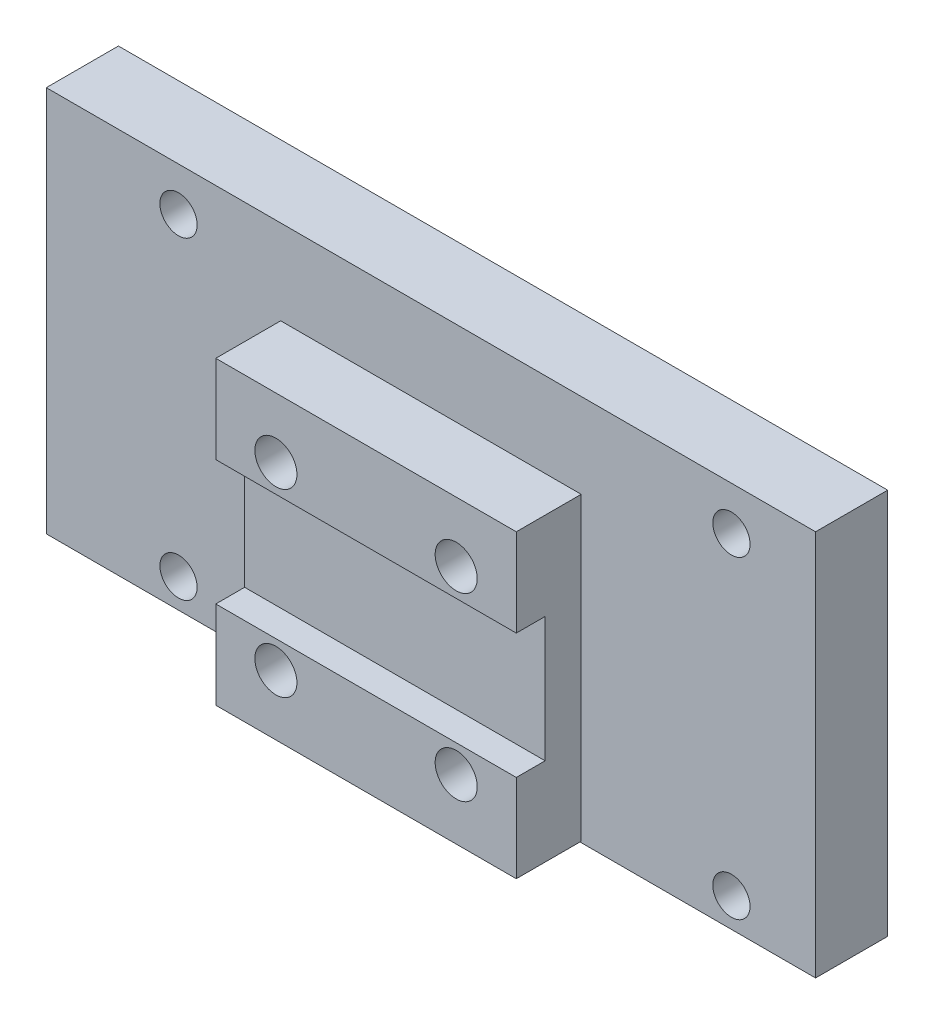
ISO-10303-21;
HEADER;
FILE_DESCRIPTION(('STEP AP214'),'2;1');
FILE_NAME('part.step','',(''),(''),'','','');
FILE_SCHEMA(('AUTOMOTIVE_DESIGN { 1 0 10303 214 1 1 1 1 }'));
ENDSEC;
DATA;
#1=APPLICATION_CONTEXT('core data for automotive mechanical design processes');
#2=APPLICATION_PROTOCOL_DEFINITION('international standard','automotive_design',2000,#1);
#3=PRODUCT_CONTEXT('',#1,'mechanical');
#4=PRODUCT('Part','Part','',(#3));
#5=PRODUCT_RELATED_PRODUCT_CATEGORY('part','',(#4));
#6=PRODUCT_DEFINITION_FORMATION('','',#4);
#7=PRODUCT_DEFINITION_CONTEXT('part definition',#1,'design');
#8=PRODUCT_DEFINITION('design','',#6,#7);
#9=PRODUCT_DEFINITION_SHAPE('','',#8);
#10=(LENGTH_UNIT() NAMED_UNIT(*) SI_UNIT(.MILLI.,.METRE.));
#11=(NAMED_UNIT(*) PLANE_ANGLE_UNIT() SI_UNIT($,.RADIAN.));
#12=(NAMED_UNIT(*) SI_UNIT($,.STERADIAN.) SOLID_ANGLE_UNIT());
#13=UNCERTAINTY_MEASURE_WITH_UNIT(LENGTH_MEASURE(1.E-05),#10,'distance_accuracy_value','');
#14=(GEOMETRIC_REPRESENTATION_CONTEXT(3) GLOBAL_UNCERTAINTY_ASSIGNED_CONTEXT((#13)) GLOBAL_UNIT_ASSIGNED_CONTEXT((#10,
#11,#12)) REPRESENTATION_CONTEXT('',''));
#15=CARTESIAN_POINT('',(0.,0.,0.));
#16=DIRECTION('',(0.,0.,1.));
#17=DIRECTION('',(1.,0.,0.));
#18=AXIS2_PLACEMENT_3D('',#15,#16,#17);
#19=CARTESIAN_POINT('',(0.,0.,3.));
#20=DIRECTION('',(0.,0.,-1.));
#21=DIRECTION('',(-1.,0.,0.));
#22=AXIS2_PLACEMENT_3D('',#19,#20,#21);
#23=PLANE('',#22);
#24=DIRECTION('',(-1.,0.,0.));
#25=VECTOR('',#24,1.);
#26=CARTESIAN_POINT('',(25.,7.30000000000001,3.));
#27=LINE('',#26,#25);
#28=CARTESIAN_POINT('',(25.,7.30000000000001,3.));
#29=VERTEX_POINT('',#28);
#30=CARTESIAN_POINT('',(0.,7.30000000000001,3.));
#31=VERTEX_POINT('',#30);
#32=EDGE_CURVE('E203',#29,#31,#27,.T.);
#33=ORIENTED_EDGE('',*,*,#32,.F.);
#34=DIRECTION('',(0.,1.,0.));
#35=VECTOR('',#34,1.);
#36=CARTESIAN_POINT('',(25.,0.,3.));
#37=LINE('',#36,#35);
#38=CARTESIAN_POINT('',(25.,17.7,3.));
#39=VERTEX_POINT('',#38);
#40=EDGE_CURVE('E246',#29,#39,#37,.T.);
#41=ORIENTED_EDGE('',*,*,#40,.T.);
#42=DIRECTION('',(1.,0.,0.));
#43=VECTOR('',#42,1.);
#44=CARTESIAN_POINT('',(0.,17.7,3.));
#45=LINE('',#44,#43);
#46=CARTESIAN_POINT('',(0.,17.7,3.));
#47=VERTEX_POINT('',#46);
#48=EDGE_CURVE('E223',#47,#39,#45,.T.);
#49=ORIENTED_EDGE('',*,*,#48,.F.);
#50=DIRECTION('',(0.,-1.,0.));
#51=VECTOR('',#50,1.);
#52=CARTESIAN_POINT('',(0.,0.,3.));
#53=LINE('',#52,#51);
#54=EDGE_CURVE('E244',#47,#31,#53,.T.);
#55=ORIENTED_EDGE('',*,*,#54,.T.);
#56=EDGE_LOOP('',(#33,#41,#49,#55));
#57=FACE_BOUND('',#56,.T.);
#58=ADVANCED_FACE('F37',(#57),#23,.F.);
#59=CARTESIAN_POINT('',(0.,0.,3.));
#60=DIRECTION('',(1.,0.,0.));
#61=DIRECTION('',(0.,0.,-1.));
#62=AXIS2_PLACEMENT_3D('',#59,#60,#61);
#63=PLANE('',#62);
#64=DIRECTION('',(0.,-1.,0.));
#65=VECTOR('',#64,1.);
#66=CARTESIAN_POINT('',(0.,0.,0.));
#67=LINE('',#66,#65);
#68=CARTESIAN_POINT('',(0.,25.,0.));
#69=VERTEX_POINT('',#68);
#70=CARTESIAN_POINT('',(0.,0.,0.));
#71=VERTEX_POINT('',#70);
#72=EDGE_CURVE('E243',#69,#71,#67,.T.);
#73=ORIENTED_EDGE('',*,*,#72,.T.);
#74=DIRECTION('',(0.,0.,-1.));
#75=VECTOR('',#74,1.);
#76=CARTESIAN_POINT('',(0.,0.,3.));
#77=LINE('',#76,#75);
#78=CARTESIAN_POINT('',(0.,0.,5.4));
#79=VERTEX_POINT('',#78);
#80=EDGE_CURVE('E11',#79,#71,#77,.T.);
#81=ORIENTED_EDGE('',*,*,#80,.F.);
#82=DIRECTION('',(0.,-1.,0.));
#83=VECTOR('',#82,1.);
#84=CARTESIAN_POINT('',(0.,7.3,5.4));
#85=LINE('',#84,#83);
#86=CARTESIAN_POINT('',(0.,7.3,5.4));
#87=VERTEX_POINT('',#86);
#88=EDGE_CURVE('E209',#87,#79,#85,.T.);
#89=ORIENTED_EDGE('',*,*,#88,.F.);
#90=DIRECTION('',(0.,0.,-1.));
#91=VECTOR('',#90,1.);
#92=CARTESIAN_POINT('',(0.,7.3,5.4));
#93=LINE('',#92,#91);
#94=EDGE_CURVE('E215',#87,#31,#93,.T.);
#95=ORIENTED_EDGE('',*,*,#94,.T.);
#96=ORIENTED_EDGE('',*,*,#54,.F.);
#97=DIRECTION('',(0.,0.,-1.));
#98=VECTOR('',#97,1.);
#99=CARTESIAN_POINT('',(0.,17.7,5.4));
#100=LINE('',#99,#98);
#101=CARTESIAN_POINT('',(0.,17.7,5.4));
#102=VERTEX_POINT('',#101);
#103=EDGE_CURVE('E240',#102,#47,#100,.T.);
#104=ORIENTED_EDGE('',*,*,#103,.F.);
#105=DIRECTION('',(0.,-1.,0.));
#106=VECTOR('',#105,1.);
#107=CARTESIAN_POINT('',(0.,25.,5.4));
#108=LINE('',#107,#106);
#109=CARTESIAN_POINT('',(0.,25.,5.4));
#110=VERTEX_POINT('',#109);
#111=EDGE_CURVE('E224',#110,#102,#108,.T.);
#112=ORIENTED_EDGE('',*,*,#111,.F.);
#113=DIRECTION('',(0.,0.,-1.));
#114=VECTOR('',#113,1.);
#115=CARTESIAN_POINT('',(0.,25.,3.));
#116=LINE('',#115,#114);
#117=EDGE_CURVE('E249',#110,#69,#116,.T.);
#118=ORIENTED_EDGE('',*,*,#117,.T.);
#119=EDGE_LOOP('',(#73,#81,#89,#95,#96,#104,#112,#118));
#120=FACE_BOUND('',#119,.T.);
#121=ADVANCED_FACE('F39',(#120),#63,.F.);
#122=CARTESIAN_POINT('',(0.,0.,3.));
#123=DIRECTION('',(0.,1.,0.));
#124=DIRECTION('',(0.,0.,1.));
#125=AXIS2_PLACEMENT_3D('',#122,#123,#124);
#126=PLANE('',#125);
#127=DIRECTION('',(1.,0.,0.));
#128=VECTOR('',#127,1.);
#129=CARTESIAN_POINT('',(0.,0.,0.));
#130=LINE('',#129,#128);
#131=CARTESIAN_POINT('',(25.,0.,0.));
#132=VERTEX_POINT('',#131);
#133=EDGE_CURVE('E252',#71,#132,#130,.T.);
#134=ORIENTED_EDGE('',*,*,#133,.T.);
#135=DIRECTION('',(0.,0.,-1.));
#136=VECTOR('',#135,1.);
#137=CARTESIAN_POINT('',(25.,0.,3.));
#138=LINE('',#137,#136);
#139=CARTESIAN_POINT('',(25.,0.,5.4));
#140=VERTEX_POINT('',#139);
#141=EDGE_CURVE('E46',#140,#132,#138,.T.);
#142=ORIENTED_EDGE('',*,*,#141,.F.);
#143=DIRECTION('',(1.,0.,0.));
#144=VECTOR('',#143,1.);
#145=CARTESIAN_POINT('',(0.,0.,5.4));
#146=LINE('',#145,#144);
#147=EDGE_CURVE('E212',#79,#140,#146,.T.);
#148=ORIENTED_EDGE('',*,*,#147,.F.);
#149=ORIENTED_EDGE('',*,*,#80,.T.);
#150=EDGE_LOOP('',(#134,#142,#148,#149));
#151=FACE_BOUND('',#150,.T.);
#152=ADVANCED_FACE('F364',(#151),#126,.F.);
#153=CARTESIAN_POINT('',(25.,0.,3.));
#154=DIRECTION('',(-1.,0.,0.));
#155=DIRECTION('',(0.,0.,1.));
#156=AXIS2_PLACEMENT_3D('',#153,#154,#155);
#157=PLANE('',#156);
#158=DIRECTION('',(0.,1.,0.));
#159=VECTOR('',#158,1.);
#160=CARTESIAN_POINT('',(25.,0.,0.));
#161=LINE('',#160,#159);
#162=CARTESIAN_POINT('',(25.,25.,0.));
#163=VERTEX_POINT('',#162);
#164=EDGE_CURVE('E255',#132,#163,#161,.T.);
#165=ORIENTED_EDGE('',*,*,#164,.T.);
#166=DIRECTION('',(0.,0.,-1.));
#167=VECTOR('',#166,1.);
#168=CARTESIAN_POINT('',(25.,25.,3.));
#169=LINE('',#168,#167);
#170=CARTESIAN_POINT('',(25.,25.,5.4));
#171=VERTEX_POINT('',#170);
#172=EDGE_CURVE('E262',#171,#163,#169,.T.);
#173=ORIENTED_EDGE('',*,*,#172,.F.);
#174=DIRECTION('',(0.,1.,0.));
#175=VECTOR('',#174,1.);
#176=CARTESIAN_POINT('',(25.,17.7,5.4));
#177=LINE('',#176,#175);
#178=CARTESIAN_POINT('',(25.,17.7,5.4));
#179=VERTEX_POINT('',#178);
#180=EDGE_CURVE('E229',#179,#171,#177,.T.);
#181=ORIENTED_EDGE('',*,*,#180,.F.);
#182=DIRECTION('',(0.,0.,-1.));
#183=VECTOR('',#182,1.);
#184=CARTESIAN_POINT('',(25.,17.7,5.4));
#185=LINE('',#184,#183);
#186=EDGE_CURVE('E235',#179,#39,#185,.T.);
#187=ORIENTED_EDGE('',*,*,#186,.T.);
#188=ORIENTED_EDGE('',*,*,#40,.F.);
#189=DIRECTION('',(0.,0.,-1.));
#190=VECTOR('',#189,1.);
#191=CARTESIAN_POINT('',(25.,7.30000000000001,5.4));
#192=LINE('',#191,#190);
#193=CARTESIAN_POINT('',(25.,7.30000000000001,5.4));
#194=VERTEX_POINT('',#193);
#195=EDGE_CURVE('E220',#194,#29,#192,.T.);
#196=ORIENTED_EDGE('',*,*,#195,.F.);
#197=DIRECTION('',(0.,1.,0.));
#198=VECTOR('',#197,1.);
#199=CARTESIAN_POINT('',(25.,0.,5.4));
#200=LINE('',#199,#198);
#201=EDGE_CURVE('E204',#140,#194,#200,.T.);
#202=ORIENTED_EDGE('',*,*,#201,.F.);
#203=ORIENTED_EDGE('',*,*,#141,.T.);
#204=EDGE_LOOP('',(#165,#173,#181,#187,#188,#196,#202,#203));
#205=FACE_BOUND('',#204,.T.);
#206=ADVANCED_FACE('F374',(#205),#157,.F.);
#207=CARTESIAN_POINT('',(0.,25.,3.));
#208=DIRECTION('',(0.,-1.,0.));
#209=DIRECTION('',(0.,0.,-1.));
#210=AXIS2_PLACEMENT_3D('',#207,#208,#209);
#211=PLANE('',#210);
#212=DIRECTION('',(-1.,0.,0.));
#213=VECTOR('',#212,1.);
#214=CARTESIAN_POINT('',(0.,25.,0.));
#215=LINE('',#214,#213);
#216=EDGE_CURVE('E247',#163,#69,#215,.T.);
#217=ORIENTED_EDGE('',*,*,#216,.T.);
#218=ORIENTED_EDGE('',*,*,#117,.F.);
#219=DIRECTION('',(-1.,0.,0.));
#220=VECTOR('',#219,1.);
#221=CARTESIAN_POINT('',(25.,25.,5.4));
#222=LINE('',#221,#220);
#223=EDGE_CURVE('E232',#171,#110,#222,.T.);
#224=ORIENTED_EDGE('',*,*,#223,.F.);
#225=ORIENTED_EDGE('',*,*,#172,.T.);
#226=EDGE_LOOP('',(#217,#218,#224,#225));
#227=FACE_BOUND('',#226,.T.);
#228=ADVANCED_FACE('F371',(#227),#211,.F.);
#229=CARTESIAN_POINT('',(5.,20.,3.));
#230=DIRECTION('',(0.,0.,-1.));
#231=DIRECTION('',(-1.,0.,0.));
#232=AXIS2_PLACEMENT_3D('',#229,#230,#231);
#233=CYLINDRICAL_SURFACE('',#232,1.75);
#234=CARTESIAN_POINT('',(5.,20.,5.4));
#235=DIRECTION('',(0.,0.,1.));
#236=DIRECTION('',(1.,0.,0.));
#237=AXIS2_PLACEMENT_3D('',#234,#235,#236);
#238=CIRCLE('',#237,1.75);
#239=CARTESIAN_POINT('',(6.75000000000001,20.,5.4));
#240=VERTEX_POINT('',#239);
#241=EDGE_CURVE('E191',#240,#240,#238,.T.);
#242=ORIENTED_EDGE('',*,*,#241,.T.);
#243=EDGE_LOOP('',(#242));
#244=FACE_BOUND('',#243,.T.);
#245=CARTESIAN_POINT('',(5.,20.,-1.));
#246=DIRECTION('',(0.,0.,-1.));
#247=DIRECTION('',(-1.,0.,0.));
#248=AXIS2_PLACEMENT_3D('',#245,#246,#247);
#249=CIRCLE('',#248,1.75);
#250=CARTESIAN_POINT('',(3.25,20.,-1.));
#251=VERTEX_POINT('',#250);
#252=EDGE_CURVE('E41',#251,#251,#249,.T.);
#253=ORIENTED_EDGE('',*,*,#252,.T.);
#254=EDGE_LOOP('',(#253));
#255=FACE_BOUND('',#254,.T.);
#256=ADVANCED_FACE('F369',(#244,#255),#233,.F.);
#257=CARTESIAN_POINT('',(20.,20.,3.));
#258=DIRECTION('',(0.,0.,-1.));
#259=DIRECTION('',(-1.,0.,0.));
#260=AXIS2_PLACEMENT_3D('',#257,#258,#259);
#261=CYLINDRICAL_SURFACE('',#260,1.75);
#262=CARTESIAN_POINT('',(20.,20.,5.4));
#263=DIRECTION('',(0.,0.,1.));
#264=DIRECTION('',(1.,0.,0.));
#265=AXIS2_PLACEMENT_3D('',#262,#263,#264);
#266=CIRCLE('',#265,1.75);
#267=CARTESIAN_POINT('',(21.75,20.,5.4));
#268=VERTEX_POINT('',#267);
#269=EDGE_CURVE('E196',#268,#268,#266,.T.);
#270=ORIENTED_EDGE('',*,*,#269,.T.);
#271=EDGE_LOOP('',(#270));
#272=FACE_BOUND('',#271,.T.);
#273=CARTESIAN_POINT('',(20.,20.,-1.));
#274=DIRECTION('',(0.,0.,-1.));
#275=DIRECTION('',(-1.,0.,0.));
#276=AXIS2_PLACEMENT_3D('',#273,#274,#275);
#277=CIRCLE('',#276,1.75);
#278=CARTESIAN_POINT('',(18.25,20.,-1.));
#279=VERTEX_POINT('',#278);
#280=EDGE_CURVE('E284',#279,#279,#277,.T.);
#281=ORIENTED_EDGE('',*,*,#280,.T.);
#282=EDGE_LOOP('',(#281));
#283=FACE_BOUND('',#282,.T.);
#284=ADVANCED_FACE('F424',(#272,#283),#261,.F.);
#285=CARTESIAN_POINT('',(5.,5.,3.));
#286=DIRECTION('',(0.,0.,-1.));
#287=DIRECTION('',(-1.,0.,0.));
#288=AXIS2_PLACEMENT_3D('',#285,#286,#287);
#289=CYLINDRICAL_SURFACE('',#288,1.75);
#290=CARTESIAN_POINT('',(5.,5.,5.4));
#291=DIRECTION('',(0.,0.,1.));
#292=DIRECTION('',(1.,0.,0.));
#293=AXIS2_PLACEMENT_3D('',#290,#291,#292);
#294=CIRCLE('',#293,1.75);
#295=CARTESIAN_POINT('',(6.75,5.,5.4));
#296=VERTEX_POINT('',#295);
#297=EDGE_CURVE('E195',#296,#296,#294,.T.);
#298=ORIENTED_EDGE('',*,*,#297,.T.);
#299=EDGE_LOOP('',(#298));
#300=FACE_BOUND('',#299,.T.);
#301=CARTESIAN_POINT('',(5.,5.,-1.));
#302=DIRECTION('',(0.,0.,-1.));
#303=DIRECTION('',(-1.,0.,0.));
#304=AXIS2_PLACEMENT_3D('',#301,#302,#303);
#305=CIRCLE('',#304,1.75);
#306=CARTESIAN_POINT('',(3.25,5.,-1.));
#307=VERTEX_POINT('',#306);
#308=EDGE_CURVE('E157',#307,#307,#305,.T.);
#309=ORIENTED_EDGE('',*,*,#308,.T.);
#310=EDGE_LOOP('',(#309));
#311=FACE_BOUND('',#310,.T.);
#312=ADVANCED_FACE('F421',(#300,#311),#289,.F.);
#313=CARTESIAN_POINT('',(20.,5.,3.));
#314=DIRECTION('',(0.,0.,-1.));
#315=DIRECTION('',(-1.,0.,0.));
#316=AXIS2_PLACEMENT_3D('',#313,#314,#315);
#317=CYLINDRICAL_SURFACE('',#316,1.75);
#318=CARTESIAN_POINT('',(20.,5.,5.4));
#319=DIRECTION('',(0.,0.,1.));
#320=DIRECTION('',(1.,0.,0.));
#321=AXIS2_PLACEMENT_3D('',#318,#319,#320);
#322=CIRCLE('',#321,1.75);
#323=CARTESIAN_POINT('',(21.75,5.,5.4));
#324=VERTEX_POINT('',#323);
#325=EDGE_CURVE('E192',#324,#324,#322,.T.);
#326=ORIENTED_EDGE('',*,*,#325,.T.);
#327=EDGE_LOOP('',(#326));
#328=FACE_BOUND('',#327,.T.);
#329=CARTESIAN_POINT('',(20.,5.,-1.));
#330=DIRECTION('',(0.,0.,-1.));
#331=DIRECTION('',(-1.,0.,0.));
#332=AXIS2_PLACEMENT_3D('',#329,#330,#331);
#333=CIRCLE('',#332,1.75);
#334=CARTESIAN_POINT('',(18.25,5.,-1.));
#335=VERTEX_POINT('',#334);
#336=EDGE_CURVE('E282',#335,#335,#333,.T.);
#337=ORIENTED_EDGE('',*,*,#336,.T.);
#338=EDGE_LOOP('',(#337));
#339=FACE_BOUND('',#338,.T.);
#340=ADVANCED_FACE('F416',(#328,#339),#317,.F.);
#341=CARTESIAN_POINT('',(0.,0.,5.4));
#342=DIRECTION('',(0.,0.,1.));
#343=DIRECTION('',(1.,0.,0.));
#344=AXIS2_PLACEMENT_3D('',#341,#342,#343);
#345=PLANE('',#344);
#346=ORIENTED_EDGE('',*,*,#241,.F.);
#347=EDGE_LOOP('',(#346));
#348=FACE_BOUND('',#347,.T.);
#349=ORIENTED_EDGE('',*,*,#269,.F.);
#350=EDGE_LOOP('',(#349));
#351=FACE_BOUND('',#350,.T.);
#352=ORIENTED_EDGE('',*,*,#111,.T.);
#353=DIRECTION('',(1.,0.,0.));
#354=VECTOR('',#353,1.);
#355=CARTESIAN_POINT('',(0.,17.7,5.4));
#356=LINE('',#355,#354);
#357=EDGE_CURVE('E227',#102,#179,#356,.T.);
#358=ORIENTED_EDGE('',*,*,#357,.T.);
#359=ORIENTED_EDGE('',*,*,#180,.T.);
#360=ORIENTED_EDGE('',*,*,#223,.T.);
#361=EDGE_LOOP('',(#352,#358,#359,#360));
#362=FACE_BOUND('',#361,.T.);
#363=ADVANCED_FACE('F397',(#348,#351,#362),#345,.T.);
#364=CARTESIAN_POINT('',(0.,17.7,5.4));
#365=DIRECTION('',(0.,1.,0.));
#366=DIRECTION('',(0.,0.,1.));
#367=AXIS2_PLACEMENT_3D('',#364,#365,#366);
#368=PLANE('',#367);
#369=ORIENTED_EDGE('',*,*,#48,.T.);
#370=ORIENTED_EDGE('',*,*,#186,.F.);
#371=ORIENTED_EDGE('',*,*,#357,.F.);
#372=ORIENTED_EDGE('',*,*,#103,.T.);
#373=EDGE_LOOP('',(#369,#370,#371,#372));
#374=FACE_BOUND('',#373,.T.);
#375=ADVANCED_FACE('F401',(#374),#368,.F.);
#376=CARTESIAN_POINT('',(25.,7.30000000000001,5.4));
#377=DIRECTION('',(0.,-1.,0.));
#378=DIRECTION('',(1.,0.,0.));
#379=AXIS2_PLACEMENT_3D('',#376,#377,#378);
#380=PLANE('',#379);
#381=ORIENTED_EDGE('',*,*,#32,.T.);
#382=ORIENTED_EDGE('',*,*,#94,.F.);
#383=DIRECTION('',(-1.,0.,0.));
#384=VECTOR('',#383,1.);
#385=CARTESIAN_POINT('',(25.,7.30000000000001,5.4));
#386=LINE('',#385,#384);
#387=EDGE_CURVE('E207',#194,#87,#386,.T.);
#388=ORIENTED_EDGE('',*,*,#387,.F.);
#389=ORIENTED_EDGE('',*,*,#195,.T.);
#390=EDGE_LOOP('',(#381,#382,#388,#389));
#391=FACE_BOUND('',#390,.T.);
#392=ADVANCED_FACE('F403',(#391),#380,.F.);
#393=CARTESIAN_POINT('',(0.,0.,5.4));
#394=DIRECTION('',(0.,0.,1.));
#395=DIRECTION('',(1.,0.,0.));
#396=AXIS2_PLACEMENT_3D('',#393,#394,#395);
#397=PLANE('',#396);
#398=ORIENTED_EDGE('',*,*,#325,.F.);
#399=EDGE_LOOP('',(#398));
#400=FACE_BOUND('',#399,.T.);
#401=ORIENTED_EDGE('',*,*,#297,.F.);
#402=EDGE_LOOP('',(#401));
#403=FACE_BOUND('',#402,.T.);
#404=ORIENTED_EDGE('',*,*,#201,.T.);
#405=ORIENTED_EDGE('',*,*,#387,.T.);
#406=ORIENTED_EDGE('',*,*,#88,.T.);
#407=ORIENTED_EDGE('',*,*,#147,.T.);
#408=EDGE_LOOP('',(#404,#405,#406,#407));
#409=FACE_BOUND('',#408,.T.);
#410=ADVANCED_FACE('F387',(#400,#403,#409),#397,.T.);
#411=CARTESIAN_POINT('',(0.,0.,0.));
#412=DIRECTION('',(0.,0.,-1.));
#413=DIRECTION('',(-1.,0.,0.));
#414=AXIS2_PLACEMENT_3D('',#411,#412,#413);
#415=PLANE('',#414);
#416=CARTESIAN_POINT('',(37.5000000000002,28.4258374810773,0.));
#417=DIRECTION('',(0.,0.,1.));
#418=DIRECTION('',(1.,0.,0.));
#419=AXIS2_PLACEMENT_3D('',#416,#417,#418);
#420=CIRCLE('',#419,1.55);
#421=CARTESIAN_POINT('',(39.0500000000002,28.4258374810773,0.));
#422=VERTEX_POINT('',#421);
#423=EDGE_CURVE('E289',#422,#422,#420,.T.);
#424=ORIENTED_EDGE('',*,*,#423,.F.);
#425=EDGE_LOOP('',(#424));
#426=FACE_BOUND('',#425,.T.);
#427=CARTESIAN_POINT('',(-8.4999999999998,28.4258374810774,0.));
#428=DIRECTION('',(0.,0.,1.));
#429=DIRECTION('',(1.,0.,0.));
#430=AXIS2_PLACEMENT_3D('',#427,#428,#429);
#431=CIRCLE('',#430,1.55);
#432=CARTESIAN_POINT('',(-6.9499999999998,28.4258374810774,0.));
#433=VERTEX_POINT('',#432);
#434=EDGE_CURVE('E293',#433,#433,#431,.T.);
#435=ORIENTED_EDGE('',*,*,#434,.F.);
#436=EDGE_LOOP('',(#435));
#437=FACE_BOUND('',#436,.T.);
#438=CARTESIAN_POINT('',(-8.4999999999998,2.32583748107735,0.));
#439=DIRECTION('',(0.,0.,1.));
#440=DIRECTION('',(1.,0.,0.));
#441=AXIS2_PLACEMENT_3D('',#438,#439,#440);
#442=CIRCLE('',#441,1.55);
#443=CARTESIAN_POINT('',(-6.9499999999998,2.32583748107735,0.));
#444=VERTEX_POINT('',#443);
#445=EDGE_CURVE('E298',#444,#444,#442,.T.);
#446=ORIENTED_EDGE('',*,*,#445,.F.);
#447=EDGE_LOOP('',(#446));
#448=FACE_BOUND('',#447,.T.);
#449=CARTESIAN_POINT('',(37.5000000000002,2.32583748107733,0.));
#450=DIRECTION('',(0.,0.,1.));
#451=DIRECTION('',(1.,0.,0.));
#452=AXIS2_PLACEMENT_3D('',#449,#450,#451);
#453=CIRCLE('',#452,1.54999999999999);
#454=CARTESIAN_POINT('',(39.0500000000002,2.32583748107733,0.));
#455=VERTEX_POINT('',#454);
#456=EDGE_CURVE('E271',#455,#455,#453,.T.);
#457=ORIENTED_EDGE('',*,*,#456,.F.);
#458=EDGE_LOOP('',(#457));
#459=FACE_BOUND('',#458,.T.);
#460=ORIENTED_EDGE('',*,*,#72,.F.);
#461=ORIENTED_EDGE('',*,*,#216,.F.);
#462=ORIENTED_EDGE('',*,*,#164,.F.);
#463=ORIENTED_EDGE('',*,*,#133,.F.);
#464=EDGE_LOOP('',(#460,#461,#462,#463));
#465=FACE_BOUND('',#464,.T.);
#466=DIRECTION('',(0.,1.,0.));
#467=VECTOR('',#466,1.);
#468=CARTESIAN_POINT('',(-19.5,32.05,0.));
#469=LINE('',#468,#467);
#470=CARTESIAN_POINT('',(-19.5,-0.0999999999999994,0.));
#471=VERTEX_POINT('',#470);
#472=CARTESIAN_POINT('',(-19.5,32.05,0.));
#473=VERTEX_POINT('',#472);
#474=EDGE_CURVE('E184',#471,#473,#469,.T.);
#475=ORIENTED_EDGE('',*,*,#474,.F.);
#476=DIRECTION('',(-1.,0.,0.));
#477=VECTOR('',#476,1.);
#478=CARTESIAN_POINT('',(-19.5,-0.0999999999999994,0.));
#479=LINE('',#478,#477);
#480=CARTESIAN_POINT('',(44.5,-0.0999999999999994,0.));
#481=VERTEX_POINT('',#480);
#482=EDGE_CURVE('E153',#481,#471,#479,.T.);
#483=ORIENTED_EDGE('',*,*,#482,.F.);
#484=DIRECTION('',(0.,-1.,0.));
#485=VECTOR('',#484,1.);
#486=CARTESIAN_POINT('',(44.5,32.05,0.));
#487=LINE('',#486,#485);
#488=CARTESIAN_POINT('',(44.5,32.05,0.));
#489=VERTEX_POINT('',#488);
#490=EDGE_CURVE('E181',#489,#481,#487,.T.);
#491=ORIENTED_EDGE('',*,*,#490,.F.);
#492=DIRECTION('',(1.,0.,0.));
#493=VECTOR('',#492,1.);
#494=CARTESIAN_POINT('',(44.5,32.05,0.));
#495=LINE('',#494,#493);
#496=EDGE_CURVE('E177',#473,#489,#495,.T.);
#497=ORIENTED_EDGE('',*,*,#496,.F.);
#498=EDGE_LOOP('',(#475,#483,#491,#497));
#499=FACE_BOUND('',#498,.T.);
#500=ADVANCED_FACE('F392',(#426,#437,#448,#459,#465,#499),#415,.F.);
#501=CARTESIAN_POINT('',(0.,0.,-6.));
#502=DIRECTION('',(0.,0.,-1.));
#503=DIRECTION('',(-1.,0.,0.));
#504=AXIS2_PLACEMENT_3D('',#501,#502,#503);
#505=PLANE('',#504);
#506=DIRECTION('',(-1.,0.,0.));
#507=VECTOR('',#506,1.);
#508=CARTESIAN_POINT('',(-19.5,-0.0999999999999994,-6.));
#509=LINE('',#508,#507);
#510=CARTESIAN_POINT('',(44.5,-0.100000000000003,-6.));
#511=VERTEX_POINT('',#510);
#512=CARTESIAN_POINT('',(-19.5,-0.0999999999999994,-6.));
#513=VERTEX_POINT('',#512);
#514=EDGE_CURVE('E54',#511,#513,#509,.T.);
#515=ORIENTED_EDGE('',*,*,#514,.T.);
#516=DIRECTION('',(0.,1.,0.));
#517=VECTOR('',#516,1.);
#518=CARTESIAN_POINT('',(-19.5,32.05,-6.));
#519=LINE('',#518,#517);
#520=CARTESIAN_POINT('',(-19.5,32.05,-6.));
#521=VERTEX_POINT('',#520);
#522=EDGE_CURVE('E164',#513,#521,#519,.T.);
#523=ORIENTED_EDGE('',*,*,#522,.T.);
#524=DIRECTION('',(1.,0.,0.));
#525=VECTOR('',#524,1.);
#526=CARTESIAN_POINT('',(44.5,32.05,-6.));
#527=LINE('',#526,#525);
#528=CARTESIAN_POINT('',(44.5,32.05,-6.));
#529=VERTEX_POINT('',#528);
#530=EDGE_CURVE('E173',#521,#529,#527,.T.);
#531=ORIENTED_EDGE('',*,*,#530,.T.);
#532=DIRECTION('',(0.,-1.,0.));
#533=VECTOR('',#532,1.);
#534=CARTESIAN_POINT('',(44.5,32.05,-6.));
#535=LINE('',#534,#533);
#536=EDGE_CURVE('E167',#529,#511,#535,.T.);
#537=ORIENTED_EDGE('',*,*,#536,.T.);
#538=EDGE_LOOP('',(#515,#523,#531,#537));
#539=FACE_BOUND('',#538,.T.);
#540=CARTESIAN_POINT('',(37.5000000000002,28.4258374810773,-6.));
#541=DIRECTION('',(0.,0.,-1.));
#542=DIRECTION('',(-1.,0.,0.));
#543=AXIS2_PLACEMENT_3D('',#540,#541,#542);
#544=CIRCLE('',#543,1.55);
#545=CARTESIAN_POINT('',(35.9500000000002,28.4258374810773,-6.));
#546=VERTEX_POINT('',#545);
#547=EDGE_CURVE('E277',#546,#546,#544,.T.);
#548=ORIENTED_EDGE('',*,*,#547,.F.);
#549=EDGE_LOOP('',(#548));
#550=FACE_BOUND('',#549,.T.);
#551=CARTESIAN_POINT('',(-8.4999999999998,28.4258374810774,-6.));
#552=DIRECTION('',(0.,0.,-1.));
#553=DIRECTION('',(-1.,0.,0.));
#554=AXIS2_PLACEMENT_3D('',#551,#552,#553);
#555=CIRCLE('',#554,1.55);
#556=CARTESIAN_POINT('',(-10.0499999999998,28.4258374810774,-6.));
#557=VERTEX_POINT('',#556);
#558=EDGE_CURVE('E274',#557,#557,#555,.T.);
#559=ORIENTED_EDGE('',*,*,#558,.F.);
#560=EDGE_LOOP('',(#559));
#561=FACE_BOUND('',#560,.T.);
#562=CARTESIAN_POINT('',(-8.4999999999998,2.32583748107735,-6.));
#563=DIRECTION('',(0.,0.,-1.));
#564=DIRECTION('',(-1.,0.,0.));
#565=AXIS2_PLACEMENT_3D('',#562,#563,#564);
#566=CIRCLE('',#565,1.55);
#567=CARTESIAN_POINT('',(-10.0499999999998,2.32583748107735,-6.));
#568=VERTEX_POINT('',#567);
#569=EDGE_CURVE('E270',#568,#568,#566,.T.);
#570=ORIENTED_EDGE('',*,*,#569,.F.);
#571=EDGE_LOOP('',(#570));
#572=FACE_BOUND('',#571,.T.);
#573=CARTESIAN_POINT('',(37.5000000000002,2.32583748107733,-6.));
#574=DIRECTION('',(0.,0.,-1.));
#575=DIRECTION('',(-1.,0.,0.));
#576=AXIS2_PLACEMENT_3D('',#573,#574,#575);
#577=CIRCLE('',#576,1.54999999999999);
#578=CARTESIAN_POINT('',(35.9500000000002,2.32583748107733,-6.));
#579=VERTEX_POINT('',#578);
#580=EDGE_CURVE('E267',#579,#579,#577,.T.);
#581=ORIENTED_EDGE('',*,*,#580,.F.);
#582=EDGE_LOOP('',(#581));
#583=FACE_BOUND('',#582,.T.);
#584=DIRECTION('',(0.,1.,0.));
#585=VECTOR('',#584,1.);
#586=CARTESIAN_POINT('',(0.,0.,-6.));
#587=LINE('',#586,#585);
#588=CARTESIAN_POINT('',(0.,0.,-6.));
#589=VERTEX_POINT('',#588);
#590=CARTESIAN_POINT('',(0.,25.,-6.));
#591=VERTEX_POINT('',#590);
#592=EDGE_CURVE('E62',#589,#591,#587,.T.);
#593=ORIENTED_EDGE('',*,*,#592,.F.);
#594=DIRECTION('',(-1.,0.,0.));
#595=VECTOR('',#594,1.);
#596=CARTESIAN_POINT('',(25.,0.,-6.));
#597=LINE('',#596,#595);
#598=CARTESIAN_POINT('',(25.,0.,-6.));
#599=VERTEX_POINT('',#598);
#600=EDGE_CURVE('E308',#599,#589,#597,.T.);
#601=ORIENTED_EDGE('',*,*,#600,.F.);
#602=DIRECTION('',(0.,-1.,0.));
#603=VECTOR('',#602,1.);
#604=CARTESIAN_POINT('',(25.,25.,-6.));
#605=LINE('',#604,#603);
#606=CARTESIAN_POINT('',(25.,25.,-6.));
#607=VERTEX_POINT('',#606);
#608=EDGE_CURVE('E322',#607,#599,#605,.T.);
#609=ORIENTED_EDGE('',*,*,#608,.F.);
#610=DIRECTION('',(1.,0.,0.));
#611=VECTOR('',#610,1.);
#612=CARTESIAN_POINT('',(0.,25.,-6.));
#613=LINE('',#612,#611);
#614=EDGE_CURVE('E319',#591,#607,#613,.T.);
#615=ORIENTED_EDGE('',*,*,#614,.F.);
#616=EDGE_LOOP('',(#593,#601,#609,#615));
#617=FACE_BOUND('',#616,.T.);
#618=ADVANCED_FACE('F162',(#539,#550,#561,#572,#583,#617),#505,.T.);
#619=CARTESIAN_POINT('',(44.5,32.05,-6.));
#620=DIRECTION('',(0.,-1.,0.));
#621=DIRECTION('',(0.,0.,-1.));
#622=AXIS2_PLACEMENT_3D('',#619,#620,#621);
#623=PLANE('',#622);
#624=ORIENTED_EDGE('',*,*,#496,.T.);
#625=DIRECTION('',(0.,0.,1.));
#626=VECTOR('',#625,1.);
#627=CARTESIAN_POINT('',(44.5,32.05,-6.));
#628=LINE('',#627,#626);
#629=EDGE_CURVE('E175',#529,#489,#628,.T.);
#630=ORIENTED_EDGE('',*,*,#629,.F.);
#631=ORIENTED_EDGE('',*,*,#530,.F.);
#632=DIRECTION('',(0.,0.,1.));
#633=VECTOR('',#632,1.);
#634=CARTESIAN_POINT('',(-19.5,32.05,-6.));
#635=LINE('',#634,#633);
#636=EDGE_CURVE('E171',#521,#473,#635,.T.);
#637=ORIENTED_EDGE('',*,*,#636,.T.);
#638=EDGE_LOOP('',(#624,#630,#631,#637));
#639=FACE_BOUND('',#638,.T.);
#640=ADVANCED_FACE('F557',(#639),#623,.F.);
#641=CARTESIAN_POINT('',(-19.5,32.05,-6.));
#642=DIRECTION('',(1.,0.,0.));
#643=DIRECTION('',(0.,0.,-1.));
#644=AXIS2_PLACEMENT_3D('',#641,#642,#643);
#645=PLANE('',#644);
#646=ORIENTED_EDGE('',*,*,#522,.F.);
#647=DIRECTION('',(0.,0.,1.));
#648=VECTOR('',#647,1.);
#649=CARTESIAN_POINT('',(-19.5,-0.0999999999999994,-6.));
#650=LINE('',#649,#648);
#651=EDGE_CURVE('E150',#513,#471,#650,.T.);
#652=ORIENTED_EDGE('',*,*,#651,.T.);
#653=ORIENTED_EDGE('',*,*,#474,.T.);
#654=ORIENTED_EDGE('',*,*,#636,.F.);
#655=EDGE_LOOP('',(#646,#652,#653,#654));
#656=FACE_BOUND('',#655,.T.);
#657=ADVANCED_FACE('F169',(#656),#645,.F.);
#658=CARTESIAN_POINT('',(44.5,32.05,-6.));
#659=DIRECTION('',(-1.,0.,0.));
#660=DIRECTION('',(0.,-1.,0.));
#661=AXIS2_PLACEMENT_3D('',#658,#659,#660);
#662=PLANE('',#661);
#663=ORIENTED_EDGE('',*,*,#490,.T.);
#664=DIRECTION('',(0.,0.,1.));
#665=VECTOR('',#664,1.);
#666=CARTESIAN_POINT('',(44.5,-0.0999999999999994,-6.));
#667=LINE('',#666,#665);
#668=EDGE_CURVE('E158',#511,#481,#667,.T.);
#669=ORIENTED_EDGE('',*,*,#668,.F.);
#670=ORIENTED_EDGE('',*,*,#536,.F.);
#671=ORIENTED_EDGE('',*,*,#629,.T.);
#672=EDGE_LOOP('',(#663,#669,#670,#671));
#673=FACE_BOUND('',#672,.T.);
#674=ADVANCED_FACE('F355',(#673),#662,.F.);
#675=CARTESIAN_POINT('',(0.,0.,-1.));
#676=DIRECTION('',(-1.,0.,0.));
#677=DIRECTION('',(0.,0.,1.));
#678=AXIS2_PLACEMENT_3D('',#675,#676,#677);
#679=PLANE('',#678);
#680=ORIENTED_EDGE('',*,*,#592,.T.);
#681=DIRECTION('',(0.,0.,-1.));
#682=VECTOR('',#681,1.);
#683=CARTESIAN_POINT('',(0.,25.,-1.));
#684=LINE('',#683,#682);
#685=CARTESIAN_POINT('',(0.,25.,-1.));
#686=VERTEX_POINT('',#685);
#687=EDGE_CURVE('E317',#686,#591,#684,.T.);
#688=ORIENTED_EDGE('',*,*,#687,.F.);
#689=DIRECTION('',(0.,1.,0.));
#690=VECTOR('',#689,1.);
#691=CARTESIAN_POINT('',(0.,0.,-1.));
#692=LINE('',#691,#690);
#693=CARTESIAN_POINT('',(0.,0.,-1.));
#694=VERTEX_POINT('',#693);
#695=EDGE_CURVE('E304',#694,#686,#692,.T.);
#696=ORIENTED_EDGE('',*,*,#695,.F.);
#697=DIRECTION('',(0.,0.,-1.));
#698=VECTOR('',#697,1.);
#699=CARTESIAN_POINT('',(0.,0.,-1.));
#700=LINE('',#699,#698);
#701=EDGE_CURVE('E185',#694,#589,#700,.T.);
#702=ORIENTED_EDGE('',*,*,#701,.T.);
#703=EDGE_LOOP('',(#680,#688,#696,#702));
#704=FACE_BOUND('',#703,.T.);
#705=ADVANCED_FACE('F345',(#704),#679,.F.);
#706=CARTESIAN_POINT('',(25.,0.,-1.));
#707=DIRECTION('',(0.,-1.,0.));
#708=DIRECTION('',(0.,0.,-1.));
#709=AXIS2_PLACEMENT_3D('',#706,#707,#708);
#710=PLANE('',#709);
#711=ORIENTED_EDGE('',*,*,#600,.T.);
#712=ORIENTED_EDGE('',*,*,#701,.F.);
#713=DIRECTION('',(-1.,0.,0.));
#714=VECTOR('',#713,1.);
#715=CARTESIAN_POINT('',(25.,0.,-1.));
#716=LINE('',#715,#714);
#717=CARTESIAN_POINT('',(25.,0.,-1.));
#718=VERTEX_POINT('',#717);
#719=EDGE_CURVE('E314',#718,#694,#716,.T.);
#720=ORIENTED_EDGE('',*,*,#719,.F.);
#721=DIRECTION('',(0.,0.,-1.));
#722=VECTOR('',#721,1.);
#723=CARTESIAN_POINT('',(25.,0.,-1.));
#724=LINE('',#723,#722);
#725=EDGE_CURVE('E328',#718,#599,#724,.T.);
#726=ORIENTED_EDGE('',*,*,#725,.T.);
#727=EDGE_LOOP('',(#711,#712,#720,#726));
#728=FACE_BOUND('',#727,.T.);
#729=ADVANCED_FACE('F347',(#728),#710,.F.);
#730=CARTESIAN_POINT('',(25.,25.,-1.));
#731=DIRECTION('',(1.,0.,0.));
#732=DIRECTION('',(0.,0.,-1.));
#733=AXIS2_PLACEMENT_3D('',#730,#731,#732);
#734=PLANE('',#733);
#735=ORIENTED_EDGE('',*,*,#608,.T.);
#736=ORIENTED_EDGE('',*,*,#725,.F.);
#737=DIRECTION('',(0.,-1.,0.));
#738=VECTOR('',#737,1.);
#739=CARTESIAN_POINT('',(25.,25.,-1.));
#740=LINE('',#739,#738);
#741=CARTESIAN_POINT('',(25.,25.,-1.));
#742=VERTEX_POINT('',#741);
#743=EDGE_CURVE('E311',#742,#718,#740,.T.);
#744=ORIENTED_EDGE('',*,*,#743,.F.);
#745=DIRECTION('',(0.,0.,-1.));
#746=VECTOR('',#745,1.);
#747=CARTESIAN_POINT('',(25.,25.,-1.));
#748=LINE('',#747,#746);
#749=EDGE_CURVE('E330',#742,#607,#748,.T.);
#750=ORIENTED_EDGE('',*,*,#749,.T.);
#751=EDGE_LOOP('',(#735,#736,#744,#750));
#752=FACE_BOUND('',#751,.T.);
#753=ADVANCED_FACE('F340',(#752),#734,.F.);
#754=CARTESIAN_POINT('',(0.,25.,-1.));
#755=DIRECTION('',(0.,1.,0.));
#756=DIRECTION('',(0.,0.,1.));
#757=AXIS2_PLACEMENT_3D('',#754,#755,#756);
#758=PLANE('',#757);
#759=ORIENTED_EDGE('',*,*,#614,.T.);
#760=ORIENTED_EDGE('',*,*,#749,.F.);
#761=DIRECTION('',(1.,0.,0.));
#762=VECTOR('',#761,1.);
#763=CARTESIAN_POINT('',(0.,25.,-1.));
#764=LINE('',#763,#762);
#765=EDGE_CURVE('E307',#686,#742,#764,.T.);
#766=ORIENTED_EDGE('',*,*,#765,.F.);
#767=ORIENTED_EDGE('',*,*,#687,.T.);
#768=EDGE_LOOP('',(#759,#760,#766,#767));
#769=FACE_BOUND('',#768,.T.);
#770=ADVANCED_FACE('F334',(#769),#758,.F.);
#771=CARTESIAN_POINT('',(0.,0.,-1.));
#772=DIRECTION('',(0.,0.,-1.));
#773=DIRECTION('',(-1.,0.,0.));
#774=AXIS2_PLACEMENT_3D('',#771,#772,#773);
#775=PLANE('',#774);
#776=ORIENTED_EDGE('',*,*,#252,.F.);
#777=EDGE_LOOP('',(#776));
#778=FACE_BOUND('',#777,.T.);
#779=ORIENTED_EDGE('',*,*,#280,.F.);
#780=EDGE_LOOP('',(#779));
#781=FACE_BOUND('',#780,.T.);
#782=ORIENTED_EDGE('',*,*,#336,.F.);
#783=EDGE_LOOP('',(#782));
#784=FACE_BOUND('',#783,.T.);
#785=ORIENTED_EDGE('',*,*,#308,.F.);
#786=EDGE_LOOP('',(#785));
#787=FACE_BOUND('',#786,.T.);
#788=ORIENTED_EDGE('',*,*,#695,.T.);
#789=ORIENTED_EDGE('',*,*,#765,.T.);
#790=ORIENTED_EDGE('',*,*,#743,.T.);
#791=ORIENTED_EDGE('',*,*,#719,.T.);
#792=EDGE_LOOP('',(#788,#789,#790,#791));
#793=FACE_BOUND('',#792,.T.);
#794=ADVANCED_FACE('F344',(#778,#781,#784,#787,#793),#775,.T.);
#795=CARTESIAN_POINT('',(37.5000000000002,2.32583748107733,-36.));
#796=DIRECTION('',(0.,0.,1.));
#797=DIRECTION('',(1.,0.,0.));
#798=AXIS2_PLACEMENT_3D('',#795,#796,#797);
#799=CYLINDRICAL_SURFACE('',#798,1.54999999999999);
#800=ORIENTED_EDGE('',*,*,#580,.T.);
#801=EDGE_LOOP('',(#800));
#802=FACE_BOUND('',#801,.T.);
#803=ORIENTED_EDGE('',*,*,#456,.T.);
#804=EDGE_LOOP('',(#803));
#805=FACE_BOUND('',#804,.T.);
#806=ADVANCED_FACE('F609',(#802,#805),#799,.F.);
#807=CARTESIAN_POINT('',(-8.4999999999998,2.32583748107735,-36.));
#808=DIRECTION('',(0.,0.,1.));
#809=DIRECTION('',(1.,0.,0.));
#810=AXIS2_PLACEMENT_3D('',#807,#808,#809);
#811=CYLINDRICAL_SURFACE('',#810,1.55);
#812=ORIENTED_EDGE('',*,*,#569,.T.);
#813=EDGE_LOOP('',(#812));
#814=FACE_BOUND('',#813,.T.);
#815=ORIENTED_EDGE('',*,*,#445,.T.);
#816=EDGE_LOOP('',(#815));
#817=FACE_BOUND('',#816,.T.);
#818=ADVANCED_FACE('F616',(#814,#817),#811,.F.);
#819=CARTESIAN_POINT('',(-8.4999999999998,28.4258374810774,-36.));
#820=DIRECTION('',(0.,0.,1.));
#821=DIRECTION('',(1.,0.,0.));
#822=AXIS2_PLACEMENT_3D('',#819,#820,#821);
#823=CYLINDRICAL_SURFACE('',#822,1.55);
#824=ORIENTED_EDGE('',*,*,#558,.T.);
#825=EDGE_LOOP('',(#824));
#826=FACE_BOUND('',#825,.T.);
#827=ORIENTED_EDGE('',*,*,#434,.T.);
#828=EDGE_LOOP('',(#827));
#829=FACE_BOUND('',#828,.T.);
#830=ADVANCED_FACE('F625',(#826,#829),#823,.F.);
#831=CARTESIAN_POINT('',(37.5000000000002,28.4258374810773,-36.));
#832=DIRECTION('',(0.,0.,1.));
#833=DIRECTION('',(1.,0.,0.));
#834=AXIS2_PLACEMENT_3D('',#831,#832,#833);
#835=CYLINDRICAL_SURFACE('',#834,1.55);
#836=ORIENTED_EDGE('',*,*,#547,.T.);
#837=EDGE_LOOP('',(#836));
#838=FACE_BOUND('',#837,.T.);
#839=ORIENTED_EDGE('',*,*,#423,.T.);
#840=EDGE_LOOP('',(#839));
#841=FACE_BOUND('',#840,.T.);
#842=ADVANCED_FACE('F634',(#838,#841),#835,.F.);
#843=CARTESIAN_POINT('',(-19.5,-0.0999999999999994,-6.));
#844=DIRECTION('',(0.,1.,0.));
#845=DIRECTION('',(0.,0.,1.));
#846=AXIS2_PLACEMENT_3D('',#843,#844,#845);
#847=PLANE('',#846);
#848=ORIENTED_EDGE('',*,*,#482,.T.);
#849=ORIENTED_EDGE('',*,*,#651,.F.);
#850=ORIENTED_EDGE('',*,*,#514,.F.);
#851=ORIENTED_EDGE('',*,*,#668,.T.);
#852=EDGE_LOOP('',(#848,#849,#850,#851));
#853=FACE_BOUND('',#852,.T.);
#854=ADVANCED_FACE('F151',(#853),#847,.F.);
#855=CLOSED_SHELL('',(#58,#121,#152,#206,#228,#256,#284,#312,#340,#363,#375,#392,#410,#500,#618,
#640,#657,#674,#705,#729,#753,#770,#794,#806,#818,#830,#842,#854));
#856=MANIFOLD_SOLID_BREP('B2',#855);
#857=ADVANCED_BREP_SHAPE_REPRESENTATION('',(#18,#856),#14);
#858=SHAPE_DEFINITION_REPRESENTATION(#9,#857);
ENDSEC;
END-ISO-10303-21;
